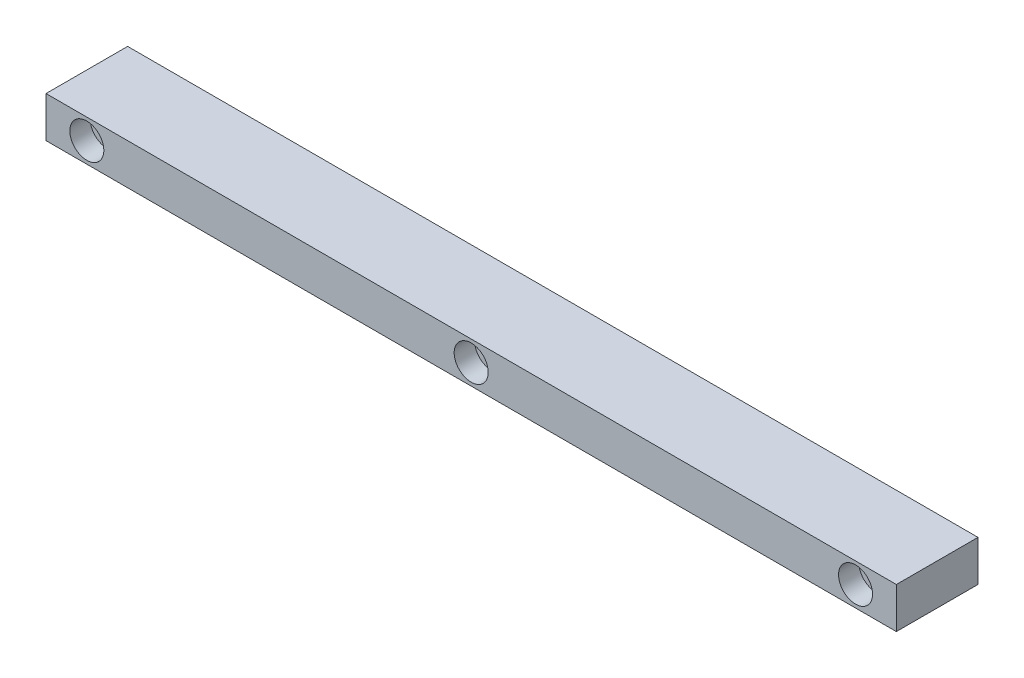
ISO-10303-21;
HEADER;
FILE_DESCRIPTION(('STEP AP214'),'2;1');
FILE_NAME('part.step','',(''),(''),'','','');
FILE_SCHEMA(('AUTOMOTIVE_DESIGN { 1 0 10303 214 1 1 1 1 }'));
ENDSEC;
DATA;
#1=APPLICATION_CONTEXT('core data for automotive mechanical design processes');
#2=APPLICATION_PROTOCOL_DEFINITION('international standard','automotive_design',2000,#1);
#3=PRODUCT_CONTEXT('',#1,'mechanical');
#4=PRODUCT('Part','Part','',(#3));
#5=PRODUCT_RELATED_PRODUCT_CATEGORY('part','',(#4));
#6=PRODUCT_DEFINITION_FORMATION('','',#4);
#7=PRODUCT_DEFINITION_CONTEXT('part definition',#1,'design');
#8=PRODUCT_DEFINITION('design','',#6,#7);
#9=PRODUCT_DEFINITION_SHAPE('','',#8);
#10=(LENGTH_UNIT() NAMED_UNIT(*) SI_UNIT(.MILLI.,.METRE.));
#11=(NAMED_UNIT(*) PLANE_ANGLE_UNIT() SI_UNIT($,.RADIAN.));
#12=(NAMED_UNIT(*) SI_UNIT($,.STERADIAN.) SOLID_ANGLE_UNIT());
#13=UNCERTAINTY_MEASURE_WITH_UNIT(LENGTH_MEASURE(1.E-05),#10,'distance_accuracy_value','');
#14=(GEOMETRIC_REPRESENTATION_CONTEXT(3) GLOBAL_UNCERTAINTY_ASSIGNED_CONTEXT((#13)) GLOBAL_UNIT_ASSIGNED_CONTEXT((#10,
#11,#12)) REPRESENTATION_CONTEXT('',''));
#15=CARTESIAN_POINT('',(0.,0.,0.));
#16=DIRECTION('',(0.,0.,1.));
#17=DIRECTION('',(1.,0.,0.));
#18=AXIS2_PLACEMENT_3D('',#15,#16,#17);
#19=CARTESIAN_POINT('',(226.000000000013,0.,0.));
#20=DIRECTION('',(0.,0.,1.00000000000005));
#21=DIRECTION('',(1.00000000000005,0.,0.));
#22=AXIS2_PLACEMENT_3D('',#19,#20,#21);
#23=CYLINDRICAL_SURFACE('',#22,3.99999999999999);
#24=CARTESIAN_POINT('',(226.000000000013,0.,36.0000000000033));
#25=DIRECTION('',(0.,0.,1.00000000000005));
#26=DIRECTION('',(1.00000000000005,0.,0.));
#27=AXIS2_PLACEMENT_3D('',#24,#25,#26);
#28=CIRCLE('',#27,3.99999999999999);
#29=CARTESIAN_POINT('',(230.000000000013,0.,36.0000000000033));
#30=VERTEX_POINT('',#29);
#31=EDGE_CURVE('E122',#30,#30,#28,.F.);
#32=ORIENTED_EDGE('',*,*,#31,.F.);
#33=EDGE_LOOP('',(#32));
#34=FACE_BOUND('',#33,.T.);
#35=CARTESIAN_POINT('',(226.000000000012,0.,12.));
#36=DIRECTION('',(0.,0.,-1.00000000000005));
#37=DIRECTION('',(-1.00000000000005,0.,0.));
#38=AXIS2_PLACEMENT_3D('',#35,#36,#37);
#39=CIRCLE('',#38,3.99999999999999);
#40=CARTESIAN_POINT('',(222.000000000012,0.,12.));
#41=VERTEX_POINT('',#40);
#42=EDGE_CURVE('E49',#41,#41,#39,.F.);
#43=ORIENTED_EDGE('',*,*,#42,.F.);
#44=EDGE_LOOP('',(#43));
#45=FACE_BOUND('',#44,.T.);
#46=ADVANCED_FACE('F45',(#34,#45),#23,.F.);
#47=CARTESIAN_POINT('',(0.,0.,0.));
#48=DIRECTION('',(0.,0.,1.00000000000005));
#49=DIRECTION('',(1.00000000000005,0.,0.));
#50=AXIS2_PLACEMENT_3D('',#47,#48,#49);
#51=CYLINDRICAL_SURFACE('',#50,4.);
#52=CARTESIAN_POINT('',(0.,0.,36.0000000000033));
#53=DIRECTION('',(0.,0.,1.00000000000005));
#54=DIRECTION('',(1.00000000000005,0.,0.));
#55=AXIS2_PLACEMENT_3D('',#52,#53,#54);
#56=CIRCLE('',#55,4.);
#57=CARTESIAN_POINT('',(4.00000000000013,0.,36.0000000000033));
#58=VERTEX_POINT('',#57);
#59=EDGE_CURVE('E137',#58,#58,#56,.F.);
#60=ORIENTED_EDGE('',*,*,#59,.F.);
#61=EDGE_LOOP('',(#60));
#62=FACE_BOUND('',#61,.T.);
#63=CARTESIAN_POINT('',(0.,0.,12.));
#64=DIRECTION('',(0.,0.,-1.00000000000005));
#65=DIRECTION('',(-1.00000000000005,0.,0.));
#66=AXIS2_PLACEMENT_3D('',#63,#64,#65);
#67=CIRCLE('',#66,4.);
#68=CARTESIAN_POINT('',(-4.00000000000029,0.,12.));
#69=VERTEX_POINT('',#68);
#70=EDGE_CURVE('E148',#69,#69,#67,.F.);
#71=ORIENTED_EDGE('',*,*,#70,.F.);
#72=EDGE_LOOP('',(#71));
#73=FACE_BOUND('',#72,.T.);
#74=ADVANCED_FACE('F259',(#62,#73),#51,.F.);
#75=CARTESIAN_POINT('',(-226.000000000014,0.,0.));
#76=DIRECTION('',(0.,0.,1.00000000000005));
#77=DIRECTION('',(1.00000000000005,0.,0.));
#78=AXIS2_PLACEMENT_3D('',#75,#76,#77);
#79=CYLINDRICAL_SURFACE('',#78,3.99999999999999);
#80=CARTESIAN_POINT('',(-226.000000000014,0.,36.0000000000033));
#81=DIRECTION('',(0.,0.,1.00000000000005));
#82=DIRECTION('',(1.00000000000005,0.,0.));
#83=AXIS2_PLACEMENT_3D('',#80,#81,#82);
#84=CIRCLE('',#83,3.99999999999999);
#85=CARTESIAN_POINT('',(-222.000000000013,0.,36.0000000000033));
#86=VERTEX_POINT('',#85);
#87=EDGE_CURVE('E133',#86,#86,#84,.F.);
#88=ORIENTED_EDGE('',*,*,#87,.F.);
#89=EDGE_LOOP('',(#88));
#90=FACE_BOUND('',#89,.T.);
#91=CARTESIAN_POINT('',(-226.000000000014,0.,12.));
#92=DIRECTION('',(0.,0.,-1.00000000000005));
#93=DIRECTION('',(-1.00000000000005,0.,0.));
#94=AXIS2_PLACEMENT_3D('',#91,#92,#93);
#95=CIRCLE('',#94,3.99999999999999);
#96=CARTESIAN_POINT('',(-230.000000000014,0.,12.));
#97=VERTEX_POINT('',#96);
#98=EDGE_CURVE('E145',#97,#97,#95,.F.);
#99=ORIENTED_EDGE('',*,*,#98,.F.);
#100=EDGE_LOOP('',(#99));
#101=FACE_BOUND('',#100,.T.);
#102=ADVANCED_FACE('F265',(#90,#101),#79,.F.);
#103=CARTESIAN_POINT('',(250.000000000013,-12.,48.0000000000057));
#104=DIRECTION('',(-1.00000000000005,0.,0.));
#105=DIRECTION('',(0.,0.,1.00000000000005));
#106=AXIS2_PLACEMENT_3D('',#103,#104,#105);
#107=PLANE('',#106);
#108=DIRECTION('',(0.,1.,0.));
#109=VECTOR('',#108,1.);
#110=CARTESIAN_POINT('',(250.000000000013,-12.,-7.7715611723761E-13));
#111=LINE('',#110,#109);
#112=CARTESIAN_POINT('',(250.000000000013,-12.,-7.7715611723761E-13));
#113=VERTEX_POINT('',#112);
#114=CARTESIAN_POINT('',(250.000000000013,12.,-9.15933995315754E-13));
#115=VERTEX_POINT('',#114);
#116=EDGE_CURVE('E118',#113,#115,#111,.T.);
#117=ORIENTED_EDGE('',*,*,#116,.T.);
#118=DIRECTION('',(0.,0.,-1.00000000000005));
#119=VECTOR('',#118,1.);
#120=CARTESIAN_POINT('',(250.000000000013,12.,48.0000000000058));
#121=LINE('',#120,#119);
#122=CARTESIAN_POINT('',(250.000000000013,12.,48.0000000000058));
#123=VERTEX_POINT('',#122);
#124=EDGE_CURVE('E11',#123,#115,#121,.T.);
#125=ORIENTED_EDGE('',*,*,#124,.F.);
#126=DIRECTION('',(0.,1.,0.));
#127=VECTOR('',#126,1.);
#128=CARTESIAN_POINT('',(250.000000000013,-12.,48.0000000000057));
#129=LINE('',#128,#127);
#130=CARTESIAN_POINT('',(250.000000000013,-12.,48.0000000000057));
#131=VERTEX_POINT('',#130);
#132=EDGE_CURVE('E100',#131,#123,#129,.T.);
#133=ORIENTED_EDGE('',*,*,#132,.F.);
#134=DIRECTION('',(0.,0.,-1.00000000000005));
#135=VECTOR('',#134,1.);
#136=CARTESIAN_POINT('',(250.000000000013,-12.,48.0000000000057));
#137=LINE('',#136,#135);
#138=EDGE_CURVE('E114',#131,#113,#137,.T.);
#139=ORIENTED_EDGE('',*,*,#138,.T.);
#140=EDGE_LOOP('',(#117,#125,#133,#139));
#141=FACE_BOUND('',#140,.T.);
#142=ADVANCED_FACE('F47',(#141),#107,.F.);
#143=CARTESIAN_POINT('',(-250.000000000013,12.,48.0000000000035));
#144=DIRECTION('',(0.,-1.,0.));
#145=DIRECTION('',(0.,0.,-1.00000000000005));
#146=AXIS2_PLACEMENT_3D('',#143,#144,#145);
#147=PLANE('',#146);
#148=DIRECTION('',(-1.00000000000005,0.,0.));
#149=VECTOR('',#148,1.);
#150=CARTESIAN_POINT('',(-250.000000000013,12.,-1.38777878078145E-13));
#151=LINE('',#150,#149);
#152=CARTESIAN_POINT('',(-250.000000000013,12.,-1.38777878078145E-13));
#153=VERTEX_POINT('',#152);
#154=EDGE_CURVE('E105',#115,#153,#151,.T.);
#155=ORIENTED_EDGE('',*,*,#154,.T.);
#156=DIRECTION('',(0.,0.,-1.00000000000005));
#157=VECTOR('',#156,1.);
#158=CARTESIAN_POINT('',(-250.000000000013,12.,48.0000000000035));
#159=LINE('',#158,#157);
#160=CARTESIAN_POINT('',(-250.000000000013,12.,48.0000000000035));
#161=VERTEX_POINT('',#160);
#162=EDGE_CURVE('E56',#161,#153,#159,.T.);
#163=ORIENTED_EDGE('',*,*,#162,.F.);
#164=DIRECTION('',(-1.00000000000005,0.,0.));
#165=VECTOR('',#164,1.);
#166=CARTESIAN_POINT('',(-250.000000000013,12.,48.0000000000035));
#167=LINE('',#166,#165);
#168=EDGE_CURVE('E95',#123,#161,#167,.T.);
#169=ORIENTED_EDGE('',*,*,#168,.F.);
#170=ORIENTED_EDGE('',*,*,#124,.T.);
#171=EDGE_LOOP('',(#155,#163,#169,#170));
#172=FACE_BOUND('',#171,.T.);
#173=ADVANCED_FACE('F104',(#172),#147,.F.);
#174=CARTESIAN_POINT('',(-250.000000000013,-12.,48.0000000000035));
#175=DIRECTION('',(1.00000000000005,0.,0.));
#176=DIRECTION('',(0.,0.,-1.00000000000005));
#177=AXIS2_PLACEMENT_3D('',#174,#175,#176);
#178=PLANE('',#177);
#179=DIRECTION('',(0.,-1.,0.));
#180=VECTOR('',#179,1.);
#181=CARTESIAN_POINT('',(-250.000000000013,-12.,0.));
#182=LINE('',#181,#180);
#183=CARTESIAN_POINT('',(-250.000000000013,-12.,0.));
#184=VERTEX_POINT('',#183);
#185=EDGE_CURVE('E82',#153,#184,#182,.T.);
#186=ORIENTED_EDGE('',*,*,#185,.T.);
#187=DIRECTION('',(0.,0.,-1.00000000000005));
#188=VECTOR('',#187,1.);
#189=CARTESIAN_POINT('',(-250.000000000013,-12.,48.0000000000035));
#190=LINE('',#189,#188);
#191=CARTESIAN_POINT('',(-250.000000000013,-12.,48.0000000000035));
#192=VERTEX_POINT('',#191);
#193=EDGE_CURVE('E107',#192,#184,#190,.T.);
#194=ORIENTED_EDGE('',*,*,#193,.F.);
#195=DIRECTION('',(0.,-1.,0.));
#196=VECTOR('',#195,1.);
#197=CARTESIAN_POINT('',(-250.000000000013,-12.,48.0000000000035));
#198=LINE('',#197,#196);
#199=EDGE_CURVE('E98',#161,#192,#198,.T.);
#200=ORIENTED_EDGE('',*,*,#199,.F.);
#201=ORIENTED_EDGE('',*,*,#162,.T.);
#202=EDGE_LOOP('',(#186,#194,#200,#201));
#203=FACE_BOUND('',#202,.T.);
#204=ADVANCED_FACE('F109',(#203),#178,.F.);
#205=CARTESIAN_POINT('',(-250.000000000013,-12.,48.0000000000035));
#206=DIRECTION('',(0.,1.,0.));
#207=DIRECTION('',(0.,0.,1.00000000000005));
#208=AXIS2_PLACEMENT_3D('',#205,#206,#207);
#209=PLANE('',#208);
#210=DIRECTION('',(1.00000000000005,0.,0.));
#211=VECTOR('',#210,1.);
#212=CARTESIAN_POINT('',(-250.000000000013,-12.,0.));
#213=LINE('',#212,#211);
#214=EDGE_CURVE('E88',#184,#113,#213,.T.);
#215=ORIENTED_EDGE('',*,*,#214,.T.);
#216=ORIENTED_EDGE('',*,*,#138,.F.);
#217=DIRECTION('',(1.00000000000005,0.,0.));
#218=VECTOR('',#217,1.);
#219=CARTESIAN_POINT('',(-250.000000000013,-12.,48.0000000000035));
#220=LINE('',#219,#218);
#221=EDGE_CURVE('E65',#192,#131,#220,.T.);
#222=ORIENTED_EDGE('',*,*,#221,.F.);
#223=ORIENTED_EDGE('',*,*,#193,.T.);
#224=EDGE_LOOP('',(#215,#216,#222,#223));
#225=FACE_BOUND('',#224,.T.);
#226=ADVANCED_FACE('F248',(#225),#209,.F.);
#227=CARTESIAN_POINT('',(0.,0.,48.000000000006));
#228=DIRECTION('',(0.,0.,-1.00000000000005));
#229=DIRECTION('',(-1.00000000000005,0.,0.));
#230=AXIS2_PLACEMENT_3D('',#227,#228,#229);
#231=PLANE('',#230);
#232=CARTESIAN_POINT('',(-226.000000000014,0.,48.000000000006));
#233=DIRECTION('',(0.,0.,1.00000000000005));
#234=DIRECTION('',(1.00000000000005,0.,0.));
#235=AXIS2_PLACEMENT_3D('',#232,#233,#234);
#236=CIRCLE('',#235,10.);
#237=CARTESIAN_POINT('',(-216.000000000013,0.,48.000000000006));
#238=VERTEX_POINT('',#237);
#239=EDGE_CURVE('E187',#238,#238,#236,.T.);
#240=ORIENTED_EDGE('',*,*,#239,.F.);
#241=EDGE_LOOP('',(#240));
#242=FACE_BOUND('',#241,.T.);
#243=CARTESIAN_POINT('',(0.,0.,48.000000000006));
#244=DIRECTION('',(0.,0.,1.00000000000005));
#245=DIRECTION('',(1.00000000000005,0.,0.));
#246=AXIS2_PLACEMENT_3D('',#243,#244,#245);
#247=CIRCLE('',#246,10.);
#248=CARTESIAN_POINT('',(10.0000000000005,0.,48.000000000006));
#249=VERTEX_POINT('',#248);
#250=EDGE_CURVE('E192',#249,#249,#247,.T.);
#251=ORIENTED_EDGE('',*,*,#250,.F.);
#252=EDGE_LOOP('',(#251));
#253=FACE_BOUND('',#252,.T.);
#254=CARTESIAN_POINT('',(226.000000000013,0.,48.000000000006));
#255=DIRECTION('',(0.,0.,1.00000000000005));
#256=DIRECTION('',(1.00000000000005,0.,0.));
#257=AXIS2_PLACEMENT_3D('',#254,#255,#256);
#258=CIRCLE('',#257,10.);
#259=CARTESIAN_POINT('',(236.000000000014,0.,48.000000000006));
#260=VERTEX_POINT('',#259);
#261=EDGE_CURVE('E163',#260,#260,#258,.T.);
#262=ORIENTED_EDGE('',*,*,#261,.F.);
#263=EDGE_LOOP('',(#262));
#264=FACE_BOUND('',#263,.T.);
#265=ORIENTED_EDGE('',*,*,#132,.T.);
#266=ORIENTED_EDGE('',*,*,#168,.T.);
#267=ORIENTED_EDGE('',*,*,#199,.T.);
#268=ORIENTED_EDGE('',*,*,#221,.T.);
#269=EDGE_LOOP('',(#265,#266,#267,#268));
#270=FACE_BOUND('',#269,.T.);
#271=ADVANCED_FACE('F96',(#242,#253,#264,#270),#231,.F.);
#272=CARTESIAN_POINT('',(0.,0.,0.));
#273=DIRECTION('',(0.,0.,-1.00000000000005));
#274=DIRECTION('',(-1.00000000000005,0.,0.));
#275=AXIS2_PLACEMENT_3D('',#272,#273,#274);
#276=PLANE('',#275);
#277=CARTESIAN_POINT('',(226.000000000013,0.,0.));
#278=DIRECTION('',(0.,0.,-1.00000000000005));
#279=DIRECTION('',(-1.00000000000005,0.,0.));
#280=AXIS2_PLACEMENT_3D('',#277,#278,#279);
#281=CIRCLE('',#280,7.00000000000001);
#282=CARTESIAN_POINT('',(219.000000000013,0.,0.));
#283=VERTEX_POINT('',#282);
#284=EDGE_CURVE('E220',#283,#283,#281,.T.);
#285=ORIENTED_EDGE('',*,*,#284,.F.);
#286=EDGE_LOOP('',(#285));
#287=FACE_BOUND('',#286,.T.);
#288=CARTESIAN_POINT('',(0.,0.,0.));
#289=DIRECTION('',(0.,0.,-1.00000000000005));
#290=DIRECTION('',(-1.00000000000005,0.,0.));
#291=AXIS2_PLACEMENT_3D('',#288,#289,#290);
#292=CIRCLE('',#291,7.);
#293=CARTESIAN_POINT('',(-7.00000000000036,0.,0.));
#294=VERTEX_POINT('',#293);
#295=EDGE_CURVE('E216',#294,#294,#292,.T.);
#296=ORIENTED_EDGE('',*,*,#295,.F.);
#297=EDGE_LOOP('',(#296));
#298=FACE_BOUND('',#297,.T.);
#299=CARTESIAN_POINT('',(-226.000000000014,0.,0.));
#300=DIRECTION('',(0.,0.,-1.00000000000005));
#301=DIRECTION('',(-1.00000000000005,0.,0.));
#302=AXIS2_PLACEMENT_3D('',#299,#300,#301);
#303=CIRCLE('',#302,7.00000000000001);
#304=CARTESIAN_POINT('',(-233.000000000014,0.,0.));
#305=VERTEX_POINT('',#304);
#306=EDGE_CURVE('E208',#305,#305,#303,.T.);
#307=ORIENTED_EDGE('',*,*,#306,.F.);
#308=EDGE_LOOP('',(#307));
#309=FACE_BOUND('',#308,.T.);
#310=ORIENTED_EDGE('',*,*,#116,.F.);
#311=ORIENTED_EDGE('',*,*,#214,.F.);
#312=ORIENTED_EDGE('',*,*,#185,.F.);
#313=ORIENTED_EDGE('',*,*,#154,.F.);
#314=EDGE_LOOP('',(#310,#311,#312,#313));
#315=FACE_BOUND('',#314,.T.);
#316=ADVANCED_FACE('F237',(#287,#298,#309,#315),#276,.T.);
#317=CARTESIAN_POINT('',(-226.000000000014,0.,36.0000000000033));
#318=DIRECTION('',(0.,0.,1.00000000000005));
#319=DIRECTION('',(1.00000000000005,0.,0.));
#320=AXIS2_PLACEMENT_3D('',#317,#318,#319);
#321=PLANE('',#320);
#322=CARTESIAN_POINT('',(-226.000000000014,0.,36.0000000000033));
#323=DIRECTION('',(0.,0.,1.00000000000005));
#324=DIRECTION('',(1.00000000000005,0.,0.));
#325=AXIS2_PLACEMENT_3D('',#322,#323,#324);
#326=CIRCLE('',#325,10.);
#327=CARTESIAN_POINT('',(-216.000000000013,0.,36.0000000000033));
#328=VERTEX_POINT('',#327);
#329=EDGE_CURVE('E138',#328,#328,#326,.T.);
#330=ORIENTED_EDGE('',*,*,#329,.T.);
#331=EDGE_LOOP('',(#330));
#332=FACE_BOUND('',#331,.T.);
#333=ORIENTED_EDGE('',*,*,#87,.T.);
#334=EDGE_LOOP('',(#333));
#335=FACE_BOUND('',#334,.T.);
#336=ADVANCED_FACE('F240',(#332,#335),#321,.T.);
#337=CARTESIAN_POINT('',(-226.000000000014,0.,36.0000000000033));
#338=DIRECTION('',(0.,0.,1.00000000000005));
#339=DIRECTION('',(1.00000000000005,0.,0.));
#340=AXIS2_PLACEMENT_3D('',#337,#338,#339);
#341=CYLINDRICAL_SURFACE('',#340,10.);
#342=ORIENTED_EDGE('',*,*,#329,.F.);
#343=EDGE_LOOP('',(#342));
#344=FACE_BOUND('',#343,.T.);
#345=ORIENTED_EDGE('',*,*,#239,.T.);
#346=EDGE_LOOP('',(#345));
#347=FACE_BOUND('',#346,.T.);
#348=ADVANCED_FACE('F286',(#344,#347),#341,.F.);
#349=CARTESIAN_POINT('',(0.,0.,36.0000000000033));
#350=DIRECTION('',(0.,0.,1.00000000000005));
#351=DIRECTION('',(1.00000000000005,0.,0.));
#352=AXIS2_PLACEMENT_3D('',#349,#350,#351);
#353=PLANE('',#352);
#354=CARTESIAN_POINT('',(0.,0.,36.0000000000033));
#355=DIRECTION('',(0.,0.,1.00000000000005));
#356=DIRECTION('',(1.00000000000005,0.,0.));
#357=AXIS2_PLACEMENT_3D('',#354,#355,#356);
#358=CIRCLE('',#357,10.);
#359=CARTESIAN_POINT('',(10.0000000000004,0.,36.0000000000033));
#360=VERTEX_POINT('',#359);
#361=EDGE_CURVE('E170',#360,#360,#358,.T.);
#362=ORIENTED_EDGE('',*,*,#361,.T.);
#363=EDGE_LOOP('',(#362));
#364=FACE_BOUND('',#363,.T.);
#365=ORIENTED_EDGE('',*,*,#59,.T.);
#366=EDGE_LOOP('',(#365));
#367=FACE_BOUND('',#366,.T.);
#368=ADVANCED_FACE('F283',(#364,#367),#353,.T.);
#369=CARTESIAN_POINT('',(0.,0.,36.0000000000033));
#370=DIRECTION('',(0.,0.,1.00000000000005));
#371=DIRECTION('',(1.00000000000005,0.,0.));
#372=AXIS2_PLACEMENT_3D('',#369,#370,#371);
#373=CYLINDRICAL_SURFACE('',#372,10.);
#374=ORIENTED_EDGE('',*,*,#361,.F.);
#375=EDGE_LOOP('',(#374));
#376=FACE_BOUND('',#375,.T.);
#377=ORIENTED_EDGE('',*,*,#250,.T.);
#378=EDGE_LOOP('',(#377));
#379=FACE_BOUND('',#378,.T.);
#380=ADVANCED_FACE('F278',(#376,#379),#373,.F.);
#381=CARTESIAN_POINT('',(226.000000000013,0.,36.0000000000033));
#382=DIRECTION('',(0.,0.,1.00000000000005));
#383=DIRECTION('',(1.00000000000005,0.,0.));
#384=AXIS2_PLACEMENT_3D('',#381,#382,#383);
#385=PLANE('',#384);
#386=CARTESIAN_POINT('',(226.000000000013,0.,36.0000000000033));
#387=DIRECTION('',(0.,0.,1.00000000000005));
#388=DIRECTION('',(1.00000000000005,0.,0.));
#389=AXIS2_PLACEMENT_3D('',#386,#387,#388);
#390=CIRCLE('',#389,10.);
#391=CARTESIAN_POINT('',(236.000000000014,0.,36.0000000000033));
#392=VERTEX_POINT('',#391);
#393=EDGE_CURVE('E157',#392,#392,#390,.T.);
#394=ORIENTED_EDGE('',*,*,#393,.T.);
#395=EDGE_LOOP('',(#394));
#396=FACE_BOUND('',#395,.T.);
#397=ORIENTED_EDGE('',*,*,#31,.T.);
#398=EDGE_LOOP('',(#397));
#399=FACE_BOUND('',#398,.T.);
#400=ADVANCED_FACE('F274',(#396,#399),#385,.T.);
#401=CARTESIAN_POINT('',(226.000000000013,0.,36.0000000000033));
#402=DIRECTION('',(0.,0.,1.00000000000005));
#403=DIRECTION('',(1.00000000000005,0.,0.));
#404=AXIS2_PLACEMENT_3D('',#401,#402,#403);
#405=CYLINDRICAL_SURFACE('',#404,10.);
#406=ORIENTED_EDGE('',*,*,#393,.F.);
#407=EDGE_LOOP('',(#406));
#408=FACE_BOUND('',#407,.T.);
#409=ORIENTED_EDGE('',*,*,#261,.T.);
#410=EDGE_LOOP('',(#409));
#411=FACE_BOUND('',#410,.T.);
#412=ADVANCED_FACE('F277',(#408,#411),#405,.F.);
#413=CARTESIAN_POINT('',(-226.000000000014,0.,12.));
#414=DIRECTION('',(0.,0.,-1.00000000000005));
#415=DIRECTION('',(-1.00000000000005,0.,0.));
#416=AXIS2_PLACEMENT_3D('',#413,#414,#415);
#417=PLANE('',#416);
#418=CARTESIAN_POINT('',(-226.000000000014,0.,12.));
#419=DIRECTION('',(0.,0.,-1.00000000000005));
#420=DIRECTION('',(-1.00000000000005,0.,0.));
#421=AXIS2_PLACEMENT_3D('',#418,#419,#420);
#422=CIRCLE('',#421,7.00000000000001);
#423=CARTESIAN_POINT('',(-233.000000000014,0.,12.));
#424=VERTEX_POINT('',#423);
#425=EDGE_CURVE('E204',#424,#424,#422,.T.);
#426=ORIENTED_EDGE('',*,*,#425,.T.);
#427=EDGE_LOOP('',(#426));
#428=FACE_BOUND('',#427,.T.);
#429=ORIENTED_EDGE('',*,*,#98,.T.);
#430=EDGE_LOOP('',(#429));
#431=FACE_BOUND('',#430,.T.);
#432=ADVANCED_FACE('F281',(#428,#431),#417,.T.);
#433=CARTESIAN_POINT('',(-226.000000000014,0.,12.));
#434=DIRECTION('',(0.,0.,-1.00000000000005));
#435=DIRECTION('',(-1.00000000000005,0.,0.));
#436=AXIS2_PLACEMENT_3D('',#433,#434,#435);
#437=CYLINDRICAL_SURFACE('',#436,7.00000000000001);
#438=ORIENTED_EDGE('',*,*,#425,.F.);
#439=EDGE_LOOP('',(#438));
#440=FACE_BOUND('',#439,.T.);
#441=ORIENTED_EDGE('',*,*,#306,.T.);
#442=EDGE_LOOP('',(#441));
#443=FACE_BOUND('',#442,.T.);
#444=ADVANCED_FACE('F298',(#440,#443),#437,.F.);
#445=CARTESIAN_POINT('',(0.,0.,12.));
#446=DIRECTION('',(0.,0.,-1.00000000000005));
#447=DIRECTION('',(-1.00000000000005,0.,0.));
#448=AXIS2_PLACEMENT_3D('',#445,#446,#447);
#449=PLANE('',#448);
#450=CARTESIAN_POINT('',(0.,0.,12.));
#451=DIRECTION('',(0.,0.,-1.00000000000005));
#452=DIRECTION('',(-1.00000000000005,0.,0.));
#453=AXIS2_PLACEMENT_3D('',#450,#451,#452);
#454=CIRCLE('',#453,7.);
#455=CARTESIAN_POINT('',(-7.00000000000045,0.,12.));
#456=VERTEX_POINT('',#455);
#457=EDGE_CURVE('E212',#456,#456,#454,.T.);
#458=ORIENTED_EDGE('',*,*,#457,.T.);
#459=EDGE_LOOP('',(#458));
#460=FACE_BOUND('',#459,.T.);
#461=ORIENTED_EDGE('',*,*,#70,.T.);
#462=EDGE_LOOP('',(#461));
#463=FACE_BOUND('',#462,.T.);
#464=ADVANCED_FACE('F302',(#460,#463),#449,.T.);
#465=CARTESIAN_POINT('',(0.,0.,12.));
#466=DIRECTION('',(0.,0.,-1.00000000000005));
#467=DIRECTION('',(-1.00000000000005,0.,0.));
#468=AXIS2_PLACEMENT_3D('',#465,#466,#467);
#469=CYLINDRICAL_SURFACE('',#468,7.);
#470=ORIENTED_EDGE('',*,*,#457,.F.);
#471=EDGE_LOOP('',(#470));
#472=FACE_BOUND('',#471,.T.);
#473=ORIENTED_EDGE('',*,*,#295,.T.);
#474=EDGE_LOOP('',(#473));
#475=FACE_BOUND('',#474,.T.);
#476=ADVANCED_FACE('F306',(#472,#475),#469,.F.);
#477=CARTESIAN_POINT('',(226.000000000012,0.,12.));
#478=DIRECTION('',(0.,0.,-1.00000000000005));
#479=DIRECTION('',(-1.00000000000005,0.,0.));
#480=AXIS2_PLACEMENT_3D('',#477,#478,#479);
#481=PLANE('',#480);
#482=CARTESIAN_POINT('',(226.000000000012,0.,12.));
#483=DIRECTION('',(0.,0.,-1.00000000000005));
#484=DIRECTION('',(-1.00000000000005,0.,0.));
#485=AXIS2_PLACEMENT_3D('',#482,#483,#484);
#486=CIRCLE('',#485,7.00000000000001);
#487=CARTESIAN_POINT('',(219.000000000011,0.,12.));
#488=VERTEX_POINT('',#487);
#489=EDGE_CURVE('E149',#488,#488,#486,.T.);
#490=ORIENTED_EDGE('',*,*,#489,.T.);
#491=EDGE_LOOP('',(#490));
#492=FACE_BOUND('',#491,.T.);
#493=ORIENTED_EDGE('',*,*,#42,.T.);
#494=EDGE_LOOP('',(#493));
#495=FACE_BOUND('',#494,.T.);
#496=ADVANCED_FACE('F229',(#492,#495),#481,.T.);
#497=CARTESIAN_POINT('',(226.000000000012,0.,12.));
#498=DIRECTION('',(0.,0.,-1.00000000000005));
#499=DIRECTION('',(-1.00000000000005,0.,0.));
#500=AXIS2_PLACEMENT_3D('',#497,#498,#499);
#501=CYLINDRICAL_SURFACE('',#500,7.00000000000001);
#502=ORIENTED_EDGE('',*,*,#489,.F.);
#503=EDGE_LOOP('',(#502));
#504=FACE_BOUND('',#503,.T.);
#505=ORIENTED_EDGE('',*,*,#284,.T.);
#506=EDGE_LOOP('',(#505));
#507=FACE_BOUND('',#506,.T.);
#508=ADVANCED_FACE('F231',(#504,#507),#501,.F.);
#509=CLOSED_SHELL('',(#46,#74,#102,#142,#173,#204,#226,#271,#316,#336,#348,#368,#380,#400,#412,
#432,#444,#464,#476,#496,#508));
#510=MANIFOLD_SOLID_BREP('B2',#509);
#511=ADVANCED_BREP_SHAPE_REPRESENTATION('',(#18,#510),#14);
#512=SHAPE_DEFINITION_REPRESENTATION(#9,#511);
ENDSEC;
END-ISO-10303-21;
